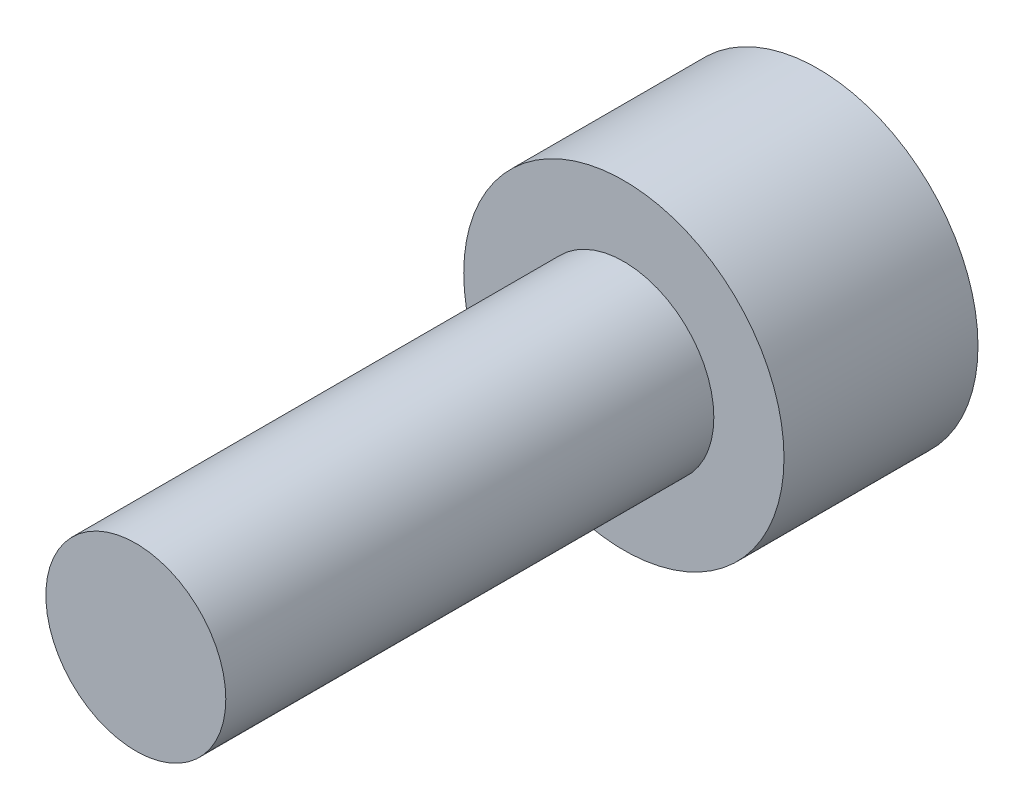
ISO-10303-21;
HEADER;
FILE_DESCRIPTION(('STEP AP214'),'2;1');
FILE_NAME('part.step','',(''),(''),'','','');
FILE_SCHEMA(('AUTOMOTIVE_DESIGN { 1 0 10303 214 1 1 1 1 }'));
ENDSEC;
DATA;
#1=APPLICATION_CONTEXT('core data for automotive mechanical design processes');
#2=APPLICATION_PROTOCOL_DEFINITION('international standard','automotive_design',2000,#1);
#3=PRODUCT_CONTEXT('',#1,'mechanical');
#4=PRODUCT('Part','Part','',(#3));
#5=PRODUCT_RELATED_PRODUCT_CATEGORY('part','',(#4));
#6=PRODUCT_DEFINITION_FORMATION('','',#4);
#7=PRODUCT_DEFINITION_CONTEXT('part definition',#1,'design');
#8=PRODUCT_DEFINITION('design','',#6,#7);
#9=PRODUCT_DEFINITION_SHAPE('','',#8);
#10=(LENGTH_UNIT() NAMED_UNIT(*) SI_UNIT(.MILLI.,.METRE.));
#11=(NAMED_UNIT(*) PLANE_ANGLE_UNIT() SI_UNIT($,.RADIAN.));
#12=(NAMED_UNIT(*) SI_UNIT($,.STERADIAN.) SOLID_ANGLE_UNIT());
#13=UNCERTAINTY_MEASURE_WITH_UNIT(LENGTH_MEASURE(1.E-05),#10,'distance_accuracy_value','');
#14=(GEOMETRIC_REPRESENTATION_CONTEXT(3) GLOBAL_UNCERTAINTY_ASSIGNED_CONTEXT((#13)) GLOBAL_UNIT_ASSIGNED_CONTEXT((#10,
#11,#12)) REPRESENTATION_CONTEXT('',''));
#15=CARTESIAN_POINT('',(0.,0.,0.));
#16=DIRECTION('',(0.,0.,1.));
#17=DIRECTION('',(1.,0.,0.));
#18=AXIS2_PLACEMENT_3D('',#15,#16,#17);
#19=CARTESIAN_POINT('',(0.,0.,3.18));
#20=DIRECTION('',(0.,0.,-1.));
#21=DIRECTION('',(-1.,0.,0.));
#22=AXIS2_PLACEMENT_3D('',#19,#20,#21);
#23=CYLINDRICAL_SURFACE('',#22,2.625);
#24=CARTESIAN_POINT('',(0.,0.,3.18));
#25=DIRECTION('',(0.,0.,1.));
#26=DIRECTION('',(1.,0.,0.));
#27=AXIS2_PLACEMENT_3D('',#24,#25,#26);
#28=CIRCLE('',#27,2.625);
#29=CARTESIAN_POINT('',(-2.625,0.,3.18));
#30=VERTEX_POINT('',#29);
#31=EDGE_CURVE('E42',#30,#30,#28,.T.);
#32=CARTESIAN_POINT('',(0.,0.,0.));
#33=DIRECTION('',(0.,0.,1.));
#34=DIRECTION('',(1.,0.,0.));
#35=AXIS2_PLACEMENT_3D('',#32,#33,#34);
#36=CIRCLE('',#35,2.625);
#37=CARTESIAN_POINT('',(-2.625,0.,0.));
#38=VERTEX_POINT('',#37);
#39=EDGE_CURVE('E38',#38,#38,#36,.T.);
#40=CARTESIAN_POINT('',(-2.625,0.,3.18));
#41=CARTESIAN_POINT('',(-2.625,0.,3.146875));
#42=CARTESIAN_POINT('',(-2.625,0.,3.11375));
#43=CARTESIAN_POINT('',(-2.625,0.,3.0475));
#44=CARTESIAN_POINT('',(-2.625,0.,3.014375));
#45=CARTESIAN_POINT('',(-2.625,0.,2.948125));
#46=CARTESIAN_POINT('',(-2.625,0.,2.915));
#47=CARTESIAN_POINT('',(-2.625,0.,2.84875));
#48=CARTESIAN_POINT('',(-2.625,0.,2.815625));
#49=CARTESIAN_POINT('',(-2.625,0.,2.749375));
#50=CARTESIAN_POINT('',(-2.625,0.,2.71625));
#51=CARTESIAN_POINT('',(-2.625,0.,2.65));
#52=CARTESIAN_POINT('',(-2.625,0.,2.616875));
#53=CARTESIAN_POINT('',(-2.625,0.,2.550625));
#54=CARTESIAN_POINT('',(-2.625,0.,2.5175));
#55=CARTESIAN_POINT('',(-2.625,0.,2.45125));
#56=CARTESIAN_POINT('',(-2.625,0.,2.418125));
#57=CARTESIAN_POINT('',(-2.625,0.,2.351875));
#58=CARTESIAN_POINT('',(-2.625,0.,2.31875));
#59=CARTESIAN_POINT('',(-2.625,0.,2.2525));
#60=CARTESIAN_POINT('',(-2.625,0.,2.219375));
#61=CARTESIAN_POINT('',(-2.625,0.,2.153125));
#62=CARTESIAN_POINT('',(-2.625,0.,2.12));
#63=CARTESIAN_POINT('',(-2.625,0.,2.05375));
#64=CARTESIAN_POINT('',(-2.625,0.,2.020625));
#65=CARTESIAN_POINT('',(-2.625,0.,1.954375));
#66=CARTESIAN_POINT('',(-2.625,0.,1.92125));
#67=CARTESIAN_POINT('',(-2.625,0.,1.855));
#68=CARTESIAN_POINT('',(-2.625,0.,1.821875));
#69=CARTESIAN_POINT('',(-2.625,0.,1.755625));
#70=CARTESIAN_POINT('',(-2.625,0.,1.7225));
#71=CARTESIAN_POINT('',(-2.625,0.,1.65625));
#72=CARTESIAN_POINT('',(-2.625,0.,1.623125));
#73=CARTESIAN_POINT('',(-2.625,0.,1.556875));
#74=CARTESIAN_POINT('',(-2.625,0.,1.52375));
#75=CARTESIAN_POINT('',(-2.625,0.,1.4575));
#76=CARTESIAN_POINT('',(-2.625,0.,1.424375));
#77=CARTESIAN_POINT('',(-2.625,0.,1.358125));
#78=CARTESIAN_POINT('',(-2.625,0.,1.325));
#79=CARTESIAN_POINT('',(-2.625,0.,1.25875));
#80=CARTESIAN_POINT('',(-2.625,0.,1.225625));
#81=CARTESIAN_POINT('',(-2.625,0.,1.159375));
#82=CARTESIAN_POINT('',(-2.625,0.,1.12625));
#83=CARTESIAN_POINT('',(-2.625,0.,1.06));
#84=CARTESIAN_POINT('',(-2.625,0.,1.026875));
#85=CARTESIAN_POINT('',(-2.625,0.,0.960625));
#86=CARTESIAN_POINT('',(-2.625,0.,0.9275));
#87=CARTESIAN_POINT('',(-2.625,0.,0.86125));
#88=CARTESIAN_POINT('',(-2.625,0.,0.828125));
#89=CARTESIAN_POINT('',(-2.625,0.,0.761875));
#90=CARTESIAN_POINT('',(-2.625,0.,0.72875));
#91=CARTESIAN_POINT('',(-2.625,0.,0.6625));
#92=CARTESIAN_POINT('',(-2.625,0.,0.629375));
#93=CARTESIAN_POINT('',(-2.625,0.,0.563125));
#94=CARTESIAN_POINT('',(-2.625,0.,0.53));
#95=CARTESIAN_POINT('',(-2.625,0.,0.46375));
#96=CARTESIAN_POINT('',(-2.625,0.,0.430625));
#97=CARTESIAN_POINT('',(-2.625,0.,0.364375));
#98=CARTESIAN_POINT('',(-2.625,0.,0.33125));
#99=CARTESIAN_POINT('',(-2.625,0.,0.265));
#100=CARTESIAN_POINT('',(-2.625,0.,0.231875));
#101=CARTESIAN_POINT('',(-2.625,0.,0.165625));
#102=CARTESIAN_POINT('',(-2.625,0.,0.1325));
#103=CARTESIAN_POINT('',(-2.625,0.,0.06625));
#104=CARTESIAN_POINT('',(-2.625,0.,0.033125));
#105=CARTESIAN_POINT('',(-2.625,0.,0.));
#106=B_SPLINE_CURVE_WITH_KNOTS('',3,(#40,#41,#42,#43,#44,#45,#46,#47,#48,#49,#50,#51,#52,#53,
#54,#55,#56,#57,#58,#59,#60,#61,#62,#63,#64,#65,#66,#67,#68,#69,#70,#71,#72,#73,#74,#75,#76,#77,
#78,#79,#80,#81,#82,#83,#84,#85,#86,#87,#88,#89,#90,#91,#92,#93,#94,#95,#96,#97,#98,#99,#100,
#101,#102,#103,#104,#105),.UNSPECIFIED.,.F.,.F.,(4,2,2,2,2,2,2,2,2,2,2,2,2,2,2,2,2,2,2,2,2,2,2,
2,2,2,2,2,2,2,2,2,4),(0.,0.0993749999999996,0.19875,0.298125,0.3975,0.496875,0.59625,0.695625,
0.795,0.894375,0.99375,1.093125,1.1925,1.291875,1.39125,1.490625,1.59,1.689375,1.78875,1.888125,
1.9875,2.086875,2.18625,2.285625,2.385,2.484375,2.58375,2.683125,2.7825,2.881875,2.98125,
3.080625,3.18),.UNSPECIFIED.);
#107=EDGE_CURVE('BSEAM35',#30,#38,#106,.T.);
#108=ORIENTED_EDGE('',*,*,#31,.F.);
#109=ORIENTED_EDGE('',*,*,#39,.T.);
#110=ORIENTED_EDGE('',*,*,#107,.T.);
#111=ORIENTED_EDGE('',*,*,#107,.F.);
#112=EDGE_LOOP('',(#108,#110,#109,#111));
#113=FACE_BOUND('',#112,.T.);
#114=ADVANCED_FACE('F35',(#113),#23,.T.);
#115=CARTESIAN_POINT('',(0.,0.,3.18));
#116=DIRECTION('',(0.,0.,1.));
#117=DIRECTION('',(1.,0.,0.));
#118=AXIS2_PLACEMENT_3D('',#115,#116,#117);
#119=PLANE('',#118);
#120=CARTESIAN_POINT('',(0.,0.,3.18));
#121=DIRECTION('',(0.,0.,1.));
#122=DIRECTION('',(1.,0.,0.));
#123=AXIS2_PLACEMENT_3D('',#120,#121,#122);
#124=CIRCLE('',#123,1.475);
#125=CARTESIAN_POINT('',(1.475,0.,3.18));
#126=VERTEX_POINT('',#125);
#127=EDGE_CURVE('E10',#126,#126,#124,.T.);
#128=ORIENTED_EDGE('',*,*,#127,.F.);
#129=EDGE_LOOP('',(#128));
#130=FACE_BOUND('',#129,.T.);
#131=ORIENTED_EDGE('',*,*,#31,.T.);
#132=EDGE_LOOP('',(#131));
#133=FACE_BOUND('',#132,.T.);
#134=ADVANCED_FACE('F59',(#130,#133),#119,.T.);
#135=CARTESIAN_POINT('',(0.,0.,0.));
#136=DIRECTION('',(0.,0.,1.));
#137=DIRECTION('',(1.,0.,0.));
#138=AXIS2_PLACEMENT_3D('',#135,#136,#137);
#139=PLANE('',#138);
#140=ORIENTED_EDGE('',*,*,#39,.F.);
#141=EDGE_LOOP('',(#140));
#142=FACE_BOUND('',#141,.T.);
#143=ADVANCED_FACE('F56',(#142),#139,.F.);
#144=CARTESIAN_POINT('',(0.,0.,11.18));
#145=DIRECTION('',(0.,0.,-1.));
#146=DIRECTION('',(-1.,0.,0.));
#147=AXIS2_PLACEMENT_3D('',#144,#145,#146);
#148=CYLINDRICAL_SURFACE('',#147,1.475);
#149=CARTESIAN_POINT('',(0.,0.,11.18));
#150=DIRECTION('',(0.,0.,1.));
#151=DIRECTION('',(1.,0.,0.));
#152=AXIS2_PLACEMENT_3D('',#149,#150,#151);
#153=CIRCLE('',#152,1.475);
#154=CARTESIAN_POINT('',(1.475,0.,11.18));
#155=VERTEX_POINT('',#154);
#156=EDGE_CURVE('E48',#155,#155,#153,.T.);
#157=ORIENTED_EDGE('',*,*,#156,.F.);
#158=EDGE_LOOP('',(#157));
#159=FACE_BOUND('',#158,.T.);
#160=ORIENTED_EDGE('',*,*,#127,.T.);
#161=EDGE_LOOP('',(#160));
#162=FACE_BOUND('',#161,.T.);
#163=ADVANCED_FACE('F58',(#159,#162),#148,.T.);
#164=CARTESIAN_POINT('',(0.,0.,11.18));
#165=DIRECTION('',(0.,0.,1.));
#166=DIRECTION('',(1.,0.,0.));
#167=AXIS2_PLACEMENT_3D('',#164,#165,#166);
#168=PLANE('',#167);
#169=ORIENTED_EDGE('',*,*,#156,.T.);
#170=EDGE_LOOP('',(#169));
#171=FACE_BOUND('',#170,.T.);
#172=ADVANCED_FACE('F64',(#171),#168,.T.);
#173=CLOSED_SHELL('',(#114,#134,#143,#163,#172));
#174=MANIFOLD_SOLID_BREP('B2',#173);
#175=ADVANCED_BREP_SHAPE_REPRESENTATION('',(#18,#174),#14);
#176=SHAPE_DEFINITION_REPRESENTATION(#9,#175);
ENDSEC;
END-ISO-10303-21;
